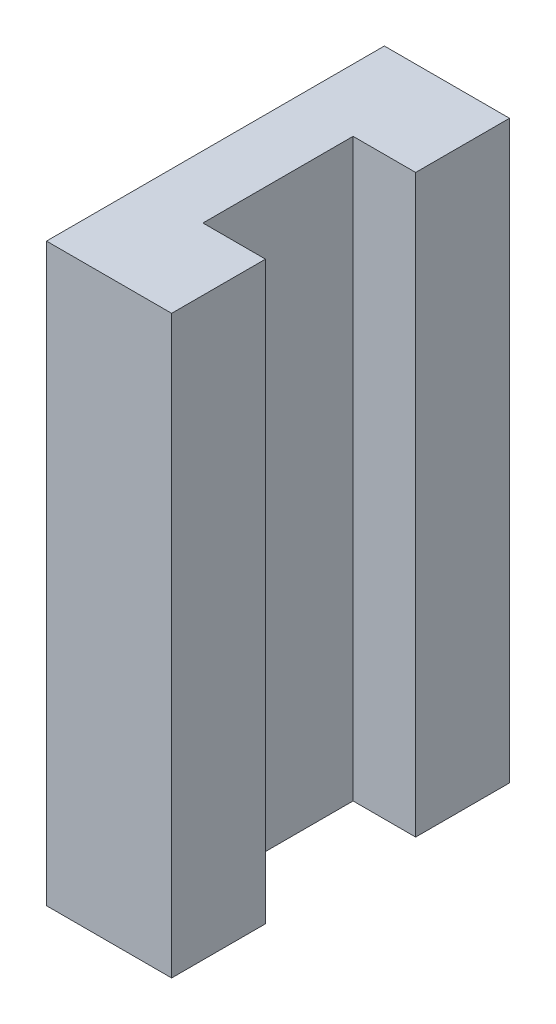
ISO-10303-21;
HEADER;
FILE_DESCRIPTION(('STEP AP214'),'2;1');
FILE_NAME('part.step','',(''),(''),'','','');
FILE_SCHEMA(('AUTOMOTIVE_DESIGN { 1 0 10303 214 1 1 1 1 }'));
ENDSEC;
DATA;
#1=APPLICATION_CONTEXT('core data for automotive mechanical design processes');
#2=APPLICATION_PROTOCOL_DEFINITION('international standard','automotive_design',2000,#1);
#3=PRODUCT_CONTEXT('',#1,'mechanical');
#4=PRODUCT('Part','Part','',(#3));
#5=PRODUCT_RELATED_PRODUCT_CATEGORY('part','',(#4));
#6=PRODUCT_DEFINITION_FORMATION('','',#4);
#7=PRODUCT_DEFINITION_CONTEXT('part definition',#1,'design');
#8=PRODUCT_DEFINITION('design','',#6,#7);
#9=PRODUCT_DEFINITION_SHAPE('','',#8);
#10=(LENGTH_UNIT() NAMED_UNIT(*) SI_UNIT(.MILLI.,.METRE.));
#11=(NAMED_UNIT(*) PLANE_ANGLE_UNIT() SI_UNIT($,.RADIAN.));
#12=(NAMED_UNIT(*) SI_UNIT($,.STERADIAN.) SOLID_ANGLE_UNIT());
#13=UNCERTAINTY_MEASURE_WITH_UNIT(LENGTH_MEASURE(1.E-05),#10,'distance_accuracy_value','');
#14=(GEOMETRIC_REPRESENTATION_CONTEXT(3) GLOBAL_UNCERTAINTY_ASSIGNED_CONTEXT((#13)) GLOBAL_UNIT_ASSIGNED_CONTEXT((#10,
#11,#12)) REPRESENTATION_CONTEXT('',''));
#15=CARTESIAN_POINT('',(0.,0.,0.));
#16=DIRECTION('',(0.,0.,1.));
#17=DIRECTION('',(1.,0.,0.));
#18=AXIS2_PLACEMENT_3D('',#15,#16,#17);
#19=CARTESIAN_POINT('',(-5.00000000000012,46.,-13.5));
#20=DIRECTION('',(0.,0.,1.));
#21=DIRECTION('',(1.,0.,0.));
#22=AXIS2_PLACEMENT_3D('',#19,#20,#21);
#23=PLANE('',#22);
#24=DIRECTION('',(-1.,0.,0.));
#25=VECTOR('',#24,1.);
#26=CARTESIAN_POINT('',(-4.99999999999996,0.,-13.5));
#27=LINE('',#26,#25);
#28=CARTESIAN_POINT('',(5.00000000000005,0.,-13.5));
#29=VERTEX_POINT('',#28);
#30=CARTESIAN_POINT('',(-4.99999999999996,0.,-13.5));
#31=VERTEX_POINT('',#30);
#32=EDGE_CURVE('E161',#29,#31,#27,.T.);
#33=ORIENTED_EDGE('',*,*,#32,.T.);
#34=DIRECTION('',(0.,-1.,0.));
#35=VECTOR('',#34,1.);
#36=CARTESIAN_POINT('',(-5.00000000000012,46.,-13.5));
#37=LINE('',#36,#35);
#38=CARTESIAN_POINT('',(-5.00000000000012,46.,-13.5));
#39=VERTEX_POINT('',#38);
#40=EDGE_CURVE('E13',#39,#31,#37,.T.);
#41=ORIENTED_EDGE('',*,*,#40,.F.);
#42=DIRECTION('',(-1.,0.,0.));
#43=VECTOR('',#42,1.);
#44=CARTESIAN_POINT('',(-5.00000000000012,46.,-13.5));
#45=LINE('',#44,#43);
#46=CARTESIAN_POINT('',(4.99999999999988,46.,-13.5));
#47=VERTEX_POINT('',#46);
#48=EDGE_CURVE('E184',#47,#39,#45,.T.);
#49=ORIENTED_EDGE('',*,*,#48,.F.);
#50=DIRECTION('',(0.,-1.,0.));
#51=VECTOR('',#50,1.);
#52=CARTESIAN_POINT('',(4.99999999999988,46.,-13.5));
#53=LINE('',#52,#51);
#54=EDGE_CURVE('E157',#47,#29,#53,.T.);
#55=ORIENTED_EDGE('',*,*,#54,.T.);
#56=EDGE_LOOP('',(#33,#41,#49,#55));
#57=FACE_BOUND('',#56,.T.);
#58=ADVANCED_FACE('F56',(#57),#23,.F.);
#59=CARTESIAN_POINT('',(-5.00000000000016,46.,13.5));
#60=DIRECTION('',(1.,0.,0.));
#61=DIRECTION('',(0.,0.,-1.));
#62=AXIS2_PLACEMENT_3D('',#59,#60,#61);
#63=PLANE('',#62);
#64=CARTESIAN_POINT('',(-5.00000000000009,33.,10.));
#65=DIRECTION('',(-1.,0.,0.));
#66=DIRECTION('',(0.,0.,1.));
#67=AXIS2_PLACEMENT_3D('',#64,#65,#66);
#68=CIRCLE('',#67,1.24999999999999);
#69=CARTESIAN_POINT('',(-5.00000000000009,33.,11.25));
#70=VERTEX_POINT('',#69);
#71=EDGE_CURVE('E257',#70,#70,#68,.T.);
#72=ORIENTED_EDGE('',*,*,#71,.F.);
#73=EDGE_LOOP('',(#72));
#74=FACE_BOUND('',#73,.T.);
#75=CARTESIAN_POINT('',(-5.0000000000001,33.,-9.99999999999999));
#76=DIRECTION('',(-1.,0.,0.));
#77=DIRECTION('',(0.,0.,1.));
#78=AXIS2_PLACEMENT_3D('',#75,#76,#77);
#79=CIRCLE('',#78,1.24999999999999);
#80=CARTESIAN_POINT('',(-5.0000000000001,33.,-8.75000000000001));
#81=VERTEX_POINT('',#80);
#82=EDGE_CURVE('E249',#81,#81,#79,.T.);
#83=ORIENTED_EDGE('',*,*,#82,.F.);
#84=EDGE_LOOP('',(#83));
#85=FACE_BOUND('',#84,.T.);
#86=CARTESIAN_POINT('',(-5.00000000000004,13.,-9.99999999999999));
#87=DIRECTION('',(-1.,0.,0.));
#88=DIRECTION('',(0.,0.,1.));
#89=AXIS2_PLACEMENT_3D('',#86,#87,#88);
#90=CIRCLE('',#89,1.24999999999999);
#91=CARTESIAN_POINT('',(-5.00000000000004,13.,-8.75000000000001));
#92=VERTEX_POINT('',#91);
#93=EDGE_CURVE('E241',#92,#92,#90,.T.);
#94=ORIENTED_EDGE('',*,*,#93,.F.);
#95=EDGE_LOOP('',(#94));
#96=FACE_BOUND('',#95,.T.);
#97=CARTESIAN_POINT('',(-5.,13.,10.));
#98=DIRECTION('',(-1.,0.,0.));
#99=DIRECTION('',(0.,0.,1.));
#100=AXIS2_PLACEMENT_3D('',#97,#98,#99);
#101=CIRCLE('',#100,1.24999999999999);
#102=CARTESIAN_POINT('',(-5.,13.,11.25));
#103=VERTEX_POINT('',#102);
#104=EDGE_CURVE('E233',#103,#103,#101,.T.);
#105=ORIENTED_EDGE('',*,*,#104,.F.);
#106=EDGE_LOOP('',(#105));
#107=FACE_BOUND('',#106,.T.);
#108=DIRECTION('',(0.,0.,1.));
#109=VECTOR('',#108,1.);
#110=CARTESIAN_POINT('',(-5.,0.,13.5));
#111=LINE('',#110,#109);
#112=CARTESIAN_POINT('',(-5.,0.,13.5));
#113=VERTEX_POINT('',#112);
#114=EDGE_CURVE('E165',#31,#113,#111,.T.);
#115=ORIENTED_EDGE('',*,*,#114,.T.);
#116=DIRECTION('',(0.,-1.,0.));
#117=VECTOR('',#116,1.);
#118=CARTESIAN_POINT('',(-5.00000000000016,46.,13.5));
#119=LINE('',#118,#117);
#120=CARTESIAN_POINT('',(-5.00000000000016,46.,13.5));
#121=VERTEX_POINT('',#120);
#122=EDGE_CURVE('E65',#121,#113,#119,.T.);
#123=ORIENTED_EDGE('',*,*,#122,.F.);
#124=DIRECTION('',(0.,0.,1.));
#125=VECTOR('',#124,1.);
#126=CARTESIAN_POINT('',(-5.00000000000016,46.,13.5));
#127=LINE('',#126,#125);
#128=EDGE_CURVE('E117',#39,#121,#127,.T.);
#129=ORIENTED_EDGE('',*,*,#128,.F.);
#130=ORIENTED_EDGE('',*,*,#40,.T.);
#131=EDGE_LOOP('',(#115,#123,#129,#130));
#132=FACE_BOUND('',#131,.T.);
#133=ADVANCED_FACE('F265',(#74,#85,#96,#107,#132),#63,.F.);
#134=CARTESIAN_POINT('',(-5.00000000000016,46.,13.5));
#135=DIRECTION('',(0.,0.,-1.));
#136=DIRECTION('',(-1.,0.,0.));
#137=AXIS2_PLACEMENT_3D('',#134,#135,#136);
#138=PLANE('',#137);
#139=DIRECTION('',(1.,0.,0.));
#140=VECTOR('',#139,1.);
#141=CARTESIAN_POINT('',(-5.,0.,13.5));
#142=LINE('',#141,#140);
#143=CARTESIAN_POINT('',(5.,0.,13.5));
#144=VERTEX_POINT('',#143);
#145=EDGE_CURVE('E169',#113,#144,#142,.T.);
#146=ORIENTED_EDGE('',*,*,#145,.T.);
#147=DIRECTION('',(0.,-1.,0.));
#148=VECTOR('',#147,1.);
#149=CARTESIAN_POINT('',(4.99999999999984,46.,13.5));
#150=LINE('',#149,#148);
#151=CARTESIAN_POINT('',(4.99999999999984,46.,13.5));
#152=VERTEX_POINT('',#151);
#153=EDGE_CURVE('E195',#152,#144,#150,.T.);
#154=ORIENTED_EDGE('',*,*,#153,.F.);
#155=DIRECTION('',(1.,0.,0.));
#156=VECTOR('',#155,1.);
#157=CARTESIAN_POINT('',(-5.00000000000016,46.,13.5));
#158=LINE('',#157,#156);
#159=EDGE_CURVE('E206',#121,#152,#158,.T.);
#160=ORIENTED_EDGE('',*,*,#159,.F.);
#161=ORIENTED_EDGE('',*,*,#122,.T.);
#162=EDGE_LOOP('',(#146,#154,#160,#161));
#163=FACE_BOUND('',#162,.T.);
#164=ADVANCED_FACE('F204',(#163),#138,.F.);
#165=CARTESIAN_POINT('',(4.99999999999984,46.,13.5));
#166=DIRECTION('',(-1.,0.,0.));
#167=DIRECTION('',(0.,0.,1.));
#168=AXIS2_PLACEMENT_3D('',#165,#166,#167);
#169=PLANE('',#168);
#170=DIRECTION('',(0.,0.,-1.));
#171=VECTOR('',#170,1.);
#172=CARTESIAN_POINT('',(5.,0.,13.5));
#173=LINE('',#172,#171);
#174=CARTESIAN_POINT('',(5.,0.,6.00000000000001));
#175=VERTEX_POINT('',#174);
#176=EDGE_CURVE('E172',#144,#175,#173,.T.);
#177=ORIENTED_EDGE('',*,*,#176,.T.);
#178=DIRECTION('',(0.,-1.,0.));
#179=VECTOR('',#178,1.);
#180=CARTESIAN_POINT('',(4.99999999999984,46.,6.00000000000001));
#181=LINE('',#180,#179);
#182=CARTESIAN_POINT('',(4.99999999999984,46.,6.00000000000001));
#183=VERTEX_POINT('',#182);
#184=EDGE_CURVE('E191',#183,#175,#181,.T.);
#185=ORIENTED_EDGE('',*,*,#184,.F.);
#186=DIRECTION('',(0.,0.,-1.));
#187=VECTOR('',#186,1.);
#188=CARTESIAN_POINT('',(4.99999999999984,46.,13.5));
#189=LINE('',#188,#187);
#190=EDGE_CURVE('E219',#152,#183,#189,.T.);
#191=ORIENTED_EDGE('',*,*,#190,.F.);
#192=ORIENTED_EDGE('',*,*,#153,.T.);
#193=EDGE_LOOP('',(#177,#185,#191,#192));
#194=FACE_BOUND('',#193,.T.);
#195=ADVANCED_FACE('F214',(#194),#169,.F.);
#196=CARTESIAN_POINT('',(4.99999999999984,46.,6.00000000000001));
#197=DIRECTION('',(0.,0.,1.));
#198=DIRECTION('',(1.,0.,0.));
#199=AXIS2_PLACEMENT_3D('',#196,#197,#198);
#200=PLANE('',#199);
#201=DIRECTION('',(-1.,0.,0.));
#202=VECTOR('',#201,1.);
#203=CARTESIAN_POINT('',(5.,0.,6.00000000000001));
#204=LINE('',#203,#202);
#205=CARTESIAN_POINT('',(0.,0.,6.00000000000001));
#206=VERTEX_POINT('',#205);
#207=EDGE_CURVE('E175',#175,#206,#204,.T.);
#208=ORIENTED_EDGE('',*,*,#207,.T.);
#209=DIRECTION('',(0.,-1.,0.));
#210=VECTOR('',#209,1.);
#211=CARTESIAN_POINT('',(-1.59594559789866E-13,46.,6.00000000000001));
#212=LINE('',#211,#210);
#213=CARTESIAN_POINT('',(-1.59594559789866E-13,46.,6.00000000000001));
#214=VERTEX_POINT('',#213);
#215=EDGE_CURVE('E149',#214,#206,#212,.T.);
#216=ORIENTED_EDGE('',*,*,#215,.F.);
#217=DIRECTION('',(-1.,0.,0.));
#218=VECTOR('',#217,1.);
#219=CARTESIAN_POINT('',(4.99999999999984,46.,6.00000000000001));
#220=LINE('',#219,#218);
#221=EDGE_CURVE('E138',#183,#214,#220,.T.);
#222=ORIENTED_EDGE('',*,*,#221,.F.);
#223=ORIENTED_EDGE('',*,*,#184,.T.);
#224=EDGE_LOOP('',(#208,#216,#222,#223));
#225=FACE_BOUND('',#224,.T.);
#226=ADVANCED_FACE('F217',(#225),#200,.F.);
#227=CARTESIAN_POINT('',(-1.17961196366423E-13,46.,-6.00000000000001));
#228=DIRECTION('',(-1.,0.,0.));
#229=DIRECTION('',(0.,0.,1.));
#230=AXIS2_PLACEMENT_3D('',#227,#228,#229);
#231=PLANE('',#230);
#232=DIRECTION('',(0.,0.,-1.));
#233=VECTOR('',#232,1.);
#234=CARTESIAN_POINT('',(0.,0.,-6.00000000000001));
#235=LINE('',#234,#233);
#236=CARTESIAN_POINT('',(0.,0.,-6.00000000000001));
#237=VERTEX_POINT('',#236);
#238=EDGE_CURVE('E147',#206,#237,#235,.T.);
#239=ORIENTED_EDGE('',*,*,#238,.T.);
#240=DIRECTION('',(0.,-1.,0.));
#241=VECTOR('',#240,1.);
#242=CARTESIAN_POINT('',(-1.17961196366423E-13,46.,-6.00000000000001));
#243=LINE('',#242,#241);
#244=CARTESIAN_POINT('',(-1.17961196366423E-13,46.,-6.00000000000001));
#245=VERTEX_POINT('',#244);
#246=EDGE_CURVE('E144',#245,#237,#243,.T.);
#247=ORIENTED_EDGE('',*,*,#246,.F.);
#248=DIRECTION('',(0.,0.,-1.));
#249=VECTOR('',#248,1.);
#250=CARTESIAN_POINT('',(-1.17961196366423E-13,46.,-6.00000000000001));
#251=LINE('',#250,#249);
#252=EDGE_CURVE('E132',#214,#245,#251,.T.);
#253=ORIENTED_EDGE('',*,*,#252,.F.);
#254=ORIENTED_EDGE('',*,*,#215,.T.);
#255=EDGE_LOOP('',(#239,#247,#253,#254));
#256=FACE_BOUND('',#255,.T.);
#257=ADVANCED_FACE('F145',(#256),#231,.F.);
#258=CARTESIAN_POINT('',(4.99999999999988,46.,-6.00000000000001));
#259=DIRECTION('',(0.,0.,-1.));
#260=DIRECTION('',(-1.,0.,0.));
#261=AXIS2_PLACEMENT_3D('',#258,#259,#260);
#262=PLANE('',#261);
#263=DIRECTION('',(1.,0.,0.));
#264=VECTOR('',#263,1.);
#265=CARTESIAN_POINT('',(5.,0.,-6.00000000000001));
#266=LINE('',#265,#264);
#267=CARTESIAN_POINT('',(5.,0.,-6.00000000000001));
#268=VERTEX_POINT('',#267);
#269=EDGE_CURVE('E103',#237,#268,#266,.T.);
#270=ORIENTED_EDGE('',*,*,#269,.T.);
#271=DIRECTION('',(0.,-1.,0.));
#272=VECTOR('',#271,1.);
#273=CARTESIAN_POINT('',(4.99999999999988,46.,-6.00000000000001));
#274=LINE('',#273,#272);
#275=CARTESIAN_POINT('',(4.99999999999988,46.,-6.00000000000001));
#276=VERTEX_POINT('',#275);
#277=EDGE_CURVE('E150',#276,#268,#274,.T.);
#278=ORIENTED_EDGE('',*,*,#277,.F.);
#279=DIRECTION('',(1.,0.,0.));
#280=VECTOR('',#279,1.);
#281=CARTESIAN_POINT('',(4.99999999999988,46.,-6.00000000000001));
#282=LINE('',#281,#280);
#283=EDGE_CURVE('E136',#245,#276,#282,.T.);
#284=ORIENTED_EDGE('',*,*,#283,.F.);
#285=ORIENTED_EDGE('',*,*,#246,.T.);
#286=EDGE_LOOP('',(#270,#278,#284,#285));
#287=FACE_BOUND('',#286,.T.);
#288=ADVANCED_FACE('F152',(#287),#262,.F.);
#289=CARTESIAN_POINT('',(4.99999999999988,46.,-6.00000000000001));
#290=DIRECTION('',(-1.,0.,0.));
#291=DIRECTION('',(0.,0.,1.));
#292=AXIS2_PLACEMENT_3D('',#289,#290,#291);
#293=PLANE('',#292);
#294=DIRECTION('',(0.,0.,-1.));
#295=VECTOR('',#294,1.);
#296=CARTESIAN_POINT('',(5.,0.,-6.00000000000001));
#297=LINE('',#296,#295);
#298=EDGE_CURVE('E109',#268,#29,#297,.T.);
#299=ORIENTED_EDGE('',*,*,#298,.T.);
#300=ORIENTED_EDGE('',*,*,#54,.F.);
#301=DIRECTION('',(0.,0.,-1.));
#302=VECTOR('',#301,1.);
#303=CARTESIAN_POINT('',(4.99999999999988,46.,-6.00000000000001));
#304=LINE('',#303,#302);
#305=EDGE_CURVE('E73',#276,#47,#304,.T.);
#306=ORIENTED_EDGE('',*,*,#305,.F.);
#307=ORIENTED_EDGE('',*,*,#277,.T.);
#308=EDGE_LOOP('',(#299,#300,#306,#307));
#309=FACE_BOUND('',#308,.T.);
#310=ADVANCED_FACE('F276',(#309),#293,.F.);
#311=CARTESIAN_POINT('',(-1.66533453693773E-13,46.,0.));
#312=DIRECTION('',(0.,1.,0.));
#313=DIRECTION('',(0.,0.,1.));
#314=AXIS2_PLACEMENT_3D('',#311,#312,#313);
#315=PLANE('',#314);
#316=ORIENTED_EDGE('',*,*,#48,.T.);
#317=ORIENTED_EDGE('',*,*,#128,.T.);
#318=ORIENTED_EDGE('',*,*,#159,.T.);
#319=ORIENTED_EDGE('',*,*,#190,.T.);
#320=ORIENTED_EDGE('',*,*,#221,.T.);
#321=ORIENTED_EDGE('',*,*,#252,.T.);
#322=ORIENTED_EDGE('',*,*,#283,.T.);
#323=ORIENTED_EDGE('',*,*,#305,.T.);
#324=EDGE_LOOP('',(#316,#317,#318,#319,#320,#321,#322,#323));
#325=FACE_BOUND('',#324,.T.);
#326=ADVANCED_FACE('F134',(#325),#315,.T.);
#327=CARTESIAN_POINT('',(0.,0.,0.));
#328=DIRECTION('',(0.,1.,0.));
#329=DIRECTION('',(0.,0.,1.));
#330=AXIS2_PLACEMENT_3D('',#327,#328,#329);
#331=PLANE('',#330);
#332=ORIENTED_EDGE('',*,*,#32,.F.);
#333=ORIENTED_EDGE('',*,*,#298,.F.);
#334=ORIENTED_EDGE('',*,*,#269,.F.);
#335=ORIENTED_EDGE('',*,*,#238,.F.);
#336=ORIENTED_EDGE('',*,*,#207,.F.);
#337=ORIENTED_EDGE('',*,*,#176,.F.);
#338=ORIENTED_EDGE('',*,*,#145,.F.);
#339=ORIENTED_EDGE('',*,*,#114,.F.);
#340=EDGE_LOOP('',(#332,#333,#334,#335,#336,#337,#338,#339));
#341=FACE_BOUND('',#340,.T.);
#342=ADVANCED_FACE('F210',(#341),#331,.F.);
#343=CARTESIAN_POINT('',(2.5,13.,10.));
#344=DIRECTION('',(-1.,0.,0.));
#345=DIRECTION('',(0.,0.,1.));
#346=AXIS2_PLACEMENT_3D('',#343,#344,#345);
#347=CONICAL_SURFACE('',#346,1.25,1.02974425867665);
#348=CARTESIAN_POINT('',(3.25107577378445,13.,10.));
#349=VERTEX_POINT('',#348);
#350=VERTEX_LOOP('',#349);
#351=FACE_BOUND('',#350,.T.);
#352=CARTESIAN_POINT('',(2.5,13.,10.));
#353=DIRECTION('',(-1.,0.,0.));
#354=DIRECTION('',(0.,0.,1.));
#355=AXIS2_PLACEMENT_3D('',#352,#353,#354);
#356=CIRCLE('',#355,1.25);
#357=CARTESIAN_POINT('',(2.5,13.,11.25));
#358=VERTEX_POINT('',#357);
#359=EDGE_CURVE('E166',#358,#358,#356,.T.);
#360=ORIENTED_EDGE('',*,*,#359,.T.);
#361=EDGE_LOOP('',(#360));
#362=FACE_BOUND('',#361,.T.);
#363=ADVANCED_FACE('F340',(#351,#362),#347,.F.);
#364=CARTESIAN_POINT('',(-5.,13.,10.));
#365=DIRECTION('',(-1.,0.,0.));
#366=DIRECTION('',(0.,0.,1.));
#367=AXIS2_PLACEMENT_3D('',#364,#365,#366);
#368=CYLINDRICAL_SURFACE('',#367,1.24999999999999);
#369=ORIENTED_EDGE('',*,*,#359,.F.);
#370=EDGE_LOOP('',(#369));
#371=FACE_BOUND('',#370,.T.);
#372=ORIENTED_EDGE('',*,*,#104,.T.);
#373=EDGE_LOOP('',(#372));
#374=FACE_BOUND('',#373,.T.);
#375=ADVANCED_FACE('F348',(#371,#374),#368,.F.);
#376=CARTESIAN_POINT('',(2.49999999999996,13.,-9.99999999999999));
#377=DIRECTION('',(-1.,0.,0.));
#378=DIRECTION('',(0.,0.,1.));
#379=AXIS2_PLACEMENT_3D('',#376,#377,#378);
#380=CONICAL_SURFACE('',#379,1.25,1.02974425867665);
#381=CARTESIAN_POINT('',(3.25107577378441,13.,-9.99999999999999));
#382=VERTEX_POINT('',#381);
#383=VERTEX_LOOP('',#382);
#384=FACE_BOUND('',#383,.T.);
#385=CARTESIAN_POINT('',(2.49999999999996,13.,-9.99999999999999));
#386=DIRECTION('',(-1.,0.,0.));
#387=DIRECTION('',(0.,0.,1.));
#388=AXIS2_PLACEMENT_3D('',#385,#386,#387);
#389=CIRCLE('',#388,1.25);
#390=CARTESIAN_POINT('',(2.49999999999996,13.,-8.75));
#391=VERTEX_POINT('',#390);
#392=EDGE_CURVE('E237',#391,#391,#389,.T.);
#393=ORIENTED_EDGE('',*,*,#392,.T.);
#394=EDGE_LOOP('',(#393));
#395=FACE_BOUND('',#394,.T.);
#396=ADVANCED_FACE('F359',(#384,#395),#380,.F.);
#397=CARTESIAN_POINT('',(-5.00000000000004,13.,-9.99999999999999));
#398=DIRECTION('',(-1.,0.,0.));
#399=DIRECTION('',(0.,0.,1.));
#400=AXIS2_PLACEMENT_3D('',#397,#398,#399);
#401=CYLINDRICAL_SURFACE('',#400,1.24999999999999);
#402=ORIENTED_EDGE('',*,*,#392,.F.);
#403=EDGE_LOOP('',(#402));
#404=FACE_BOUND('',#403,.T.);
#405=ORIENTED_EDGE('',*,*,#93,.T.);
#406=EDGE_LOOP('',(#405));
#407=FACE_BOUND('',#406,.T.);
#408=ADVANCED_FACE('F370',(#404,#407),#401,.F.);
#409=CARTESIAN_POINT('',(2.49999999999991,33.,-9.99999999999999));
#410=DIRECTION('',(-1.,0.,0.));
#411=DIRECTION('',(0.,0.,1.));
#412=AXIS2_PLACEMENT_3D('',#409,#410,#411);
#413=CONICAL_SURFACE('',#412,1.25,1.02974425867666);
#414=CARTESIAN_POINT('',(3.25107577378436,33.,-9.99999999999999));
#415=VERTEX_POINT('',#414);
#416=VERTEX_LOOP('',#415);
#417=FACE_BOUND('',#416,.T.);
#418=CARTESIAN_POINT('',(2.49999999999991,33.,-9.99999999999999));
#419=DIRECTION('',(-1.,0.,0.));
#420=DIRECTION('',(0.,0.,1.));
#421=AXIS2_PLACEMENT_3D('',#418,#419,#420);
#422=CIRCLE('',#421,1.25);
#423=CARTESIAN_POINT('',(2.49999999999991,33.,-8.74999999999999));
#424=VERTEX_POINT('',#423);
#425=EDGE_CURVE('E245',#424,#424,#422,.T.);
#426=ORIENTED_EDGE('',*,*,#425,.T.);
#427=EDGE_LOOP('',(#426));
#428=FACE_BOUND('',#427,.T.);
#429=ADVANCED_FACE('F380',(#417,#428),#413,.F.);
#430=CARTESIAN_POINT('',(-5.0000000000001,33.,-9.99999999999999));
#431=DIRECTION('',(-1.,0.,0.));
#432=DIRECTION('',(0.,0.,1.));
#433=AXIS2_PLACEMENT_3D('',#430,#431,#432);
#434=CYLINDRICAL_SURFACE('',#433,1.24999999999999);
#435=ORIENTED_EDGE('',*,*,#425,.F.);
#436=EDGE_LOOP('',(#435));
#437=FACE_BOUND('',#436,.T.);
#438=ORIENTED_EDGE('',*,*,#82,.T.);
#439=EDGE_LOOP('',(#438));
#440=FACE_BOUND('',#439,.T.);
#441=ADVANCED_FACE('F391',(#437,#440),#434,.F.);
#442=CARTESIAN_POINT('',(2.49999999999991,33.,10.));
#443=DIRECTION('',(-1.,0.,0.));
#444=DIRECTION('',(0.,0.,1.));
#445=AXIS2_PLACEMENT_3D('',#442,#443,#444);
#446=CONICAL_SURFACE('',#445,1.25,1.02974425867666);
#447=CARTESIAN_POINT('',(3.25107577378436,33.,10.));
#448=VERTEX_POINT('',#447);
#449=VERTEX_LOOP('',#448);
#450=FACE_BOUND('',#449,.T.);
#451=CARTESIAN_POINT('',(2.49999999999991,33.,10.));
#452=DIRECTION('',(-1.,0.,0.));
#453=DIRECTION('',(0.,0.,1.));
#454=AXIS2_PLACEMENT_3D('',#451,#452,#453);
#455=CIRCLE('',#454,1.25);
#456=CARTESIAN_POINT('',(2.49999999999991,33.,11.25));
#457=VERTEX_POINT('',#456);
#458=EDGE_CURVE('E253',#457,#457,#455,.T.);
#459=ORIENTED_EDGE('',*,*,#458,.T.);
#460=EDGE_LOOP('',(#459));
#461=FACE_BOUND('',#460,.T.);
#462=ADVANCED_FACE('F401',(#450,#461),#446,.F.);
#463=CARTESIAN_POINT('',(-5.00000000000008,33.,10.));
#464=DIRECTION('',(-1.,0.,0.));
#465=DIRECTION('',(0.,0.,1.));
#466=AXIS2_PLACEMENT_3D('',#463,#464,#465);
#467=CYLINDRICAL_SURFACE('',#466,1.24999999999999);
#468=ORIENTED_EDGE('',*,*,#458,.F.);
#469=EDGE_LOOP('',(#468));
#470=FACE_BOUND('',#469,.T.);
#471=ORIENTED_EDGE('',*,*,#71,.T.);
#472=EDGE_LOOP('',(#471));
#473=FACE_BOUND('',#472,.T.);
#474=ADVANCED_FACE('F263',(#470,#473),#467,.F.);
#475=CLOSED_SHELL('',(#58,#133,#164,#195,#226,#257,#288,#310,#326,#342,#363,#375,#396,#408,#429,
#441,#462,#474));
#476=MANIFOLD_SOLID_BREP('B2',#475);
#477=ADVANCED_BREP_SHAPE_REPRESENTATION('',(#18,#476),#14);
#478=SHAPE_DEFINITION_REPRESENTATION(#9,#477);
ENDSEC;
END-ISO-10303-21;
